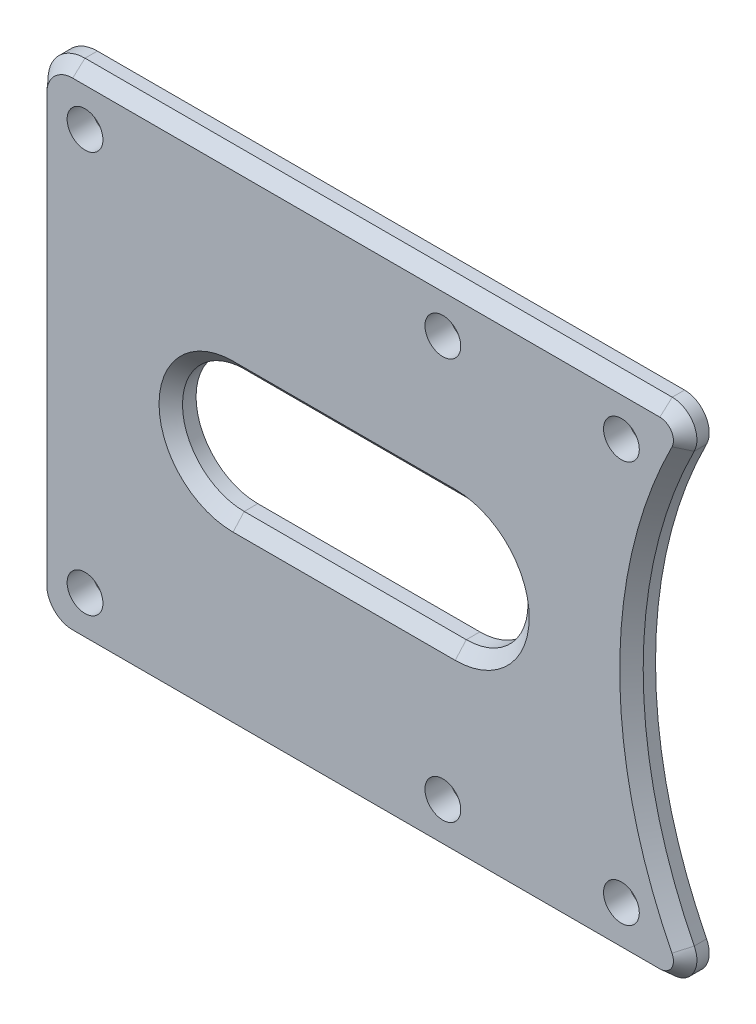
ISO-10303-21;
HEADER;
FILE_DESCRIPTION(('STEP AP214'),'2;1');
FILE_NAME('part.step','',(''),(''),'','','');
FILE_SCHEMA(('AUTOMOTIVE_DESIGN { 1 0 10303 214 1 1 1 1 }'));
ENDSEC;
DATA;
#1=APPLICATION_CONTEXT('core data for automotive mechanical design processes');
#2=APPLICATION_PROTOCOL_DEFINITION('international standard','automotive_design',2000,#1);
#3=PRODUCT_CONTEXT('',#1,'mechanical');
#4=PRODUCT('Part','Part','',(#3));
#5=PRODUCT_RELATED_PRODUCT_CATEGORY('part','',(#4));
#6=PRODUCT_DEFINITION_FORMATION('','',#4);
#7=PRODUCT_DEFINITION_CONTEXT('part definition',#1,'design');
#8=PRODUCT_DEFINITION('design','',#6,#7);
#9=PRODUCT_DEFINITION_SHAPE('','',#8);
#10=(LENGTH_UNIT() NAMED_UNIT(*) SI_UNIT(.MILLI.,.METRE.));
#11=(NAMED_UNIT(*) PLANE_ANGLE_UNIT() SI_UNIT($,.RADIAN.));
#12=(NAMED_UNIT(*) SI_UNIT($,.STERADIAN.) SOLID_ANGLE_UNIT());
#13=UNCERTAINTY_MEASURE_WITH_UNIT(LENGTH_MEASURE(1.E-05),#10,'distance_accuracy_value','');
#14=(GEOMETRIC_REPRESENTATION_CONTEXT(3) GLOBAL_UNCERTAINTY_ASSIGNED_CONTEXT((#13)) GLOBAL_UNIT_ASSIGNED_CONTEXT((#10,
#11,#12)) REPRESENTATION_CONTEXT('',''));
#15=CARTESIAN_POINT('',(0.,0.,0.));
#16=DIRECTION('',(0.,0.,1.));
#17=DIRECTION('',(1.,0.,0.));
#18=AXIS2_PLACEMENT_3D('',#15,#16,#17);
#19=CARTESIAN_POINT('',(151.26488013173,-17.2640458755177,2.));
#20=DIRECTION('',(0.,0.,-1.));
#21=DIRECTION('',(-1.,0.,0.));
#22=AXIS2_PLACEMENT_3D('',#19,#20,#21);
#23=PLANE('',#22);
#24=CARTESIAN_POINT('',(164.26488013173,0.,2.));
#25=DIRECTION('',(0.,0.,-1.));
#26=DIRECTION('',(-1.,0.,0.));
#27=AXIS2_PLACEMENT_3D('',#24,#25,#26);
#28=CIRCLE('',#27,6.00000000000001);
#29=CARTESIAN_POINT('',(164.26488013173,-6.00000000000001,2.));
#30=VERTEX_POINT('',#29);
#31=CARTESIAN_POINT('',(164.26488013173,6.00000000000001,2.));
#32=VERTEX_POINT('',#31);
#33=EDGE_CURVE('E328',#30,#32,#28,.T.);
#34=ORIENTED_EDGE('',*,*,#33,.T.);
#35=DIRECTION('',(1.,0.,0.));
#36=VECTOR('',#35,1.);
#37=CARTESIAN_POINT('',(182.26488013173,6.00000000000001,2.));
#38=LINE('',#37,#36);
#39=CARTESIAN_POINT('',(182.26488013173,6.00000000000001,2.));
#40=VERTEX_POINT('',#39);
#41=EDGE_CURVE('E330',#32,#40,#38,.T.);
#42=ORIENTED_EDGE('',*,*,#41,.T.);
#43=CARTESIAN_POINT('',(182.26488013173,0.,2.));
#44=DIRECTION('',(0.,0.,-1.));
#45=DIRECTION('',(-1.,0.,0.));
#46=AXIS2_PLACEMENT_3D('',#43,#44,#45);
#47=CIRCLE('',#46,6.00000000000001);
#48=CARTESIAN_POINT('',(182.26488013173,-6.00000000000001,2.));
#49=VERTEX_POINT('',#48);
#50=EDGE_CURVE('E326',#40,#49,#47,.T.);
#51=ORIENTED_EDGE('',*,*,#50,.T.);
#52=DIRECTION('',(-1.,0.,0.));
#53=VECTOR('',#52,1.);
#54=CARTESIAN_POINT('',(164.26488013173,-6.00000000000001,2.));
#55=LINE('',#54,#53);
#56=EDGE_CURVE('E324',#49,#30,#55,.T.);
#57=ORIENTED_EDGE('',*,*,#56,.T.);
#58=EDGE_LOOP('',(#34,#42,#51,#57));
#59=FACE_BOUND('',#58,.T.);
#60=CARTESIAN_POINT('',(198.852045310188,18.264045875515,2.));
#61=DIRECTION('',(0.,0.,-1.));
#62=DIRECTION('',(-1.,0.,0.));
#63=AXIS2_PLACEMENT_3D('',#60,#61,#62);
#64=CIRCLE('',#63,1.09959595570216);
#65=CARTESIAN_POINT('',(199.833480983863,17.7681675797256,2.));
#66=VERTEX_POINT('',#65);
#67=CARTESIAN_POINT('',(198.852045310188,19.3636418312171,2.));
#68=VERTEX_POINT('',#67);
#69=EDGE_CURVE('E279',#66,#68,#64,.F.);
#70=ORIENTED_EDGE('',*,*,#69,.T.);
#71=DIRECTION('',(-1.,0.,0.));
#72=VECTOR('',#71,1.);
#73=CARTESIAN_POINT('',(151.26488013173,19.3636418312172,2.));
#74=LINE('',#73,#72);
#75=CARTESIAN_POINT('',(151.26488013173,19.3636418312171,2.));
#76=VERTEX_POINT('',#75);
#77=EDGE_CURVE('E283',#68,#76,#74,.T.);
#78=ORIENTED_EDGE('',*,*,#77,.T.);
#79=CARTESIAN_POINT('',(151.26488013173,17.264045875515,2.));
#80=DIRECTION('',(0.,0.,-1.));
#81=DIRECTION('',(-1.,0.,0.));
#82=AXIS2_PLACEMENT_3D('',#79,#80,#81);
#83=CIRCLE('',#82,2.09959595570219);
#84=CARTESIAN_POINT('',(149.165284176028,17.264045875515,2.));
#85=VERTEX_POINT('',#84);
#86=EDGE_CURVE('E281',#76,#85,#83,.F.);
#87=ORIENTED_EDGE('',*,*,#86,.T.);
#88=DIRECTION('',(0.,-1.,0.));
#89=VECTOR('',#88,1.);
#90=CARTESIAN_POINT('',(149.165284176027,-17.2640458755177,2.));
#91=LINE('',#90,#89);
#92=CARTESIAN_POINT('',(149.165284176027,-17.2640458755177,2.));
#93=VERTEX_POINT('',#92);
#94=EDGE_CURVE('E277',#85,#93,#91,.T.);
#95=ORIENTED_EDGE('',*,*,#94,.T.);
#96=CARTESIAN_POINT('',(151.26488013173,-17.2640458755177,2.));
#97=DIRECTION('',(0.,0.,-1.));
#98=DIRECTION('',(-1.,0.,0.));
#99=AXIS2_PLACEMENT_3D('',#96,#97,#98);
#100=CIRCLE('',#99,2.09959595570214);
#101=CARTESIAN_POINT('',(151.26488013173,-19.3636418312199,2.));
#102=VERTEX_POINT('',#101);
#103=EDGE_CURVE('E273',#93,#102,#100,.F.);
#104=ORIENTED_EDGE('',*,*,#103,.T.);
#105=DIRECTION('',(1.,0.,0.));
#106=VECTOR('',#105,1.);
#107=CARTESIAN_POINT('',(151.26488013173,-19.3636418312199,2.));
#108=LINE('',#107,#106);
#109=CARTESIAN_POINT('',(198.852045310195,-19.3636418312199,2.));
#110=VERTEX_POINT('',#109);
#111=EDGE_CURVE('E269',#102,#110,#108,.T.);
#112=ORIENTED_EDGE('',*,*,#111,.T.);
#113=CARTESIAN_POINT('',(198.852045310195,-18.2640458755177,2.));
#114=DIRECTION('',(0.,0.,-1.));
#115=DIRECTION('',(-1.,0.,0.));
#116=AXIS2_PLACEMENT_3D('',#113,#114,#115);
#117=CIRCLE('',#116,1.09959595570218);
#118=CARTESIAN_POINT('',(199.83348098387,-17.768167579728,2.));
#119=VERTEX_POINT('',#118);
#120=EDGE_CURVE('E271',#110,#119,#117,.F.);
#121=ORIENTED_EDGE('',*,*,#120,.T.);
#122=CARTESIAN_POINT('',(235.000000000008,5.5795212200449E-12,2.));
#123=DIRECTION('',(0.,0.,-1.));
#124=DIRECTION('',(-1.,0.,0.));
#125=AXIS2_PLACEMENT_3D('',#122,#123,#124);
#126=CIRCLE('',#125,39.4004040442978);
#127=EDGE_CURVE('E275',#119,#66,#126,.T.);
#128=ORIENTED_EDGE('',*,*,#127,.T.);
#129=EDGE_LOOP('',(#70,#78,#87,#95,#104,#112,#121,#128));
#130=FACE_BOUND('',#129,.T.);
#131=CARTESIAN_POINT('',(195.735119868269,-16.2640458755166,2.));
#132=DIRECTION('',(0.,0.,1.));
#133=DIRECTION('',(1.,0.,0.));
#134=AXIS2_PLACEMENT_3D('',#131,#132,#133);
#135=CIRCLE('',#134,1.45);
#136=CARTESIAN_POINT('',(197.185119868269,-16.2640458755166,2.));
#137=VERTEX_POINT('',#136);
#138=EDGE_CURVE('E194',#137,#137,#135,.T.);
#139=ORIENTED_EDGE('',*,*,#138,.F.);
#140=EDGE_LOOP('',(#139));
#141=FACE_BOUND('',#140,.T.);
#142=CARTESIAN_POINT('',(181.26488013173,-16.264045875518,2.));
#143=DIRECTION('',(0.,0.,1.));
#144=DIRECTION('',(1.,0.,0.));
#145=AXIS2_PLACEMENT_3D('',#142,#143,#144);
#146=CIRCLE('',#145,1.45);
#147=CARTESIAN_POINT('',(182.71488013173,-16.264045875518,2.));
#148=VERTEX_POINT('',#147);
#149=EDGE_CURVE('E200',#148,#148,#146,.T.);
#150=ORIENTED_EDGE('',*,*,#149,.F.);
#151=EDGE_LOOP('',(#150));
#152=FACE_BOUND('',#151,.T.);
#153=CARTESIAN_POINT('',(152.26488013173,-16.2640458755177,2.));
#154=DIRECTION('',(0.,0.,1.));
#155=DIRECTION('',(1.,0.,0.));
#156=AXIS2_PLACEMENT_3D('',#153,#154,#155);
#157=CIRCLE('',#156,1.45);
#158=CARTESIAN_POINT('',(153.71488013173,-16.2640458755177,2.));
#159=VERTEX_POINT('',#158);
#160=EDGE_CURVE('E206',#159,#159,#157,.T.);
#161=ORIENTED_EDGE('',*,*,#160,.F.);
#162=EDGE_LOOP('',(#161));
#163=FACE_BOUND('',#162,.T.);
#164=CARTESIAN_POINT('',(195.73511986827,16.2640458755161,2.));
#165=DIRECTION('',(0.,0.,1.));
#166=DIRECTION('',(1.,0.,0.));
#167=AXIS2_PLACEMENT_3D('',#164,#165,#166);
#168=CIRCLE('',#167,1.45);
#169=CARTESIAN_POINT('',(197.18511986827,16.2640458755161,2.));
#170=VERTEX_POINT('',#169);
#171=EDGE_CURVE('E212',#170,#170,#168,.T.);
#172=ORIENTED_EDGE('',*,*,#171,.F.);
#173=EDGE_LOOP('',(#172));
#174=FACE_BOUND('',#173,.T.);
#175=CARTESIAN_POINT('',(181.26488013173,16.2640458755147,2.));
#176=DIRECTION('',(0.,0.,1.));
#177=DIRECTION('',(1.,0.,0.));
#178=AXIS2_PLACEMENT_3D('',#175,#176,#177);
#179=CIRCLE('',#178,1.45);
#180=CARTESIAN_POINT('',(182.71488013173,16.2640458755147,2.));
#181=VERTEX_POINT('',#180);
#182=EDGE_CURVE('E218',#181,#181,#179,.T.);
#183=ORIENTED_EDGE('',*,*,#182,.F.);
#184=EDGE_LOOP('',(#183));
#185=FACE_BOUND('',#184,.T.);
#186=CARTESIAN_POINT('',(152.26488013173,16.2640458755149,2.));
#187=DIRECTION('',(0.,0.,1.));
#188=DIRECTION('',(1.,0.,0.));
#189=AXIS2_PLACEMENT_3D('',#186,#187,#188);
#190=CIRCLE('',#189,1.45);
#191=CARTESIAN_POINT('',(153.71488013173,16.2640458755149,2.));
#192=VERTEX_POINT('',#191);
#193=EDGE_CURVE('E224',#192,#192,#190,.T.);
#194=ORIENTED_EDGE('',*,*,#193,.F.);
#195=EDGE_LOOP('',(#194));
#196=FACE_BOUND('',#195,.T.);
#197=ADVANCED_FACE('F36',(#59,#130,#141,#152,#163,#174,#185,#196),#23,.F.);
#198=CARTESIAN_POINT('',(151.26488013173,-17.2640458755177,0.));
#199=DIRECTION('',(0.,0.,-1.));
#200=DIRECTION('',(-1.,0.,0.));
#201=AXIS2_PLACEMENT_3D('',#198,#199,#200);
#202=PLANE('',#201);
#203=CARTESIAN_POINT('',(181.26488013173,-16.264045875518,0.));
#204=DIRECTION('',(0.,0.,1.));
#205=DIRECTION('',(1.,0.,0.));
#206=AXIS2_PLACEMENT_3D('',#203,#204,#205);
#207=CIRCLE('',#206,1.45);
#208=CARTESIAN_POINT('',(182.71488013173,-16.264045875518,0.));
#209=VERTEX_POINT('',#208);
#210=EDGE_CURVE('E197',#209,#209,#207,.T.);
#211=ORIENTED_EDGE('',*,*,#210,.T.);
#212=EDGE_LOOP('',(#211));
#213=FACE_BOUND('',#212,.T.);
#214=CARTESIAN_POINT('',(195.73511986827,16.2640458755161,0.));
#215=DIRECTION('',(0.,0.,1.));
#216=DIRECTION('',(1.,0.,0.));
#217=AXIS2_PLACEMENT_3D('',#214,#215,#216);
#218=CIRCLE('',#217,1.45);
#219=CARTESIAN_POINT('',(197.18511986827,16.2640458755161,0.));
#220=VERTEX_POINT('',#219);
#221=EDGE_CURVE('E209',#220,#220,#218,.T.);
#222=ORIENTED_EDGE('',*,*,#221,.T.);
#223=EDGE_LOOP('',(#222));
#224=FACE_BOUND('',#223,.T.);
#225=CARTESIAN_POINT('',(152.26488013173,16.2640458755149,0.));
#226=DIRECTION('',(0.,0.,1.));
#227=DIRECTION('',(1.,0.,0.));
#228=AXIS2_PLACEMENT_3D('',#225,#226,#227);
#229=CIRCLE('',#228,1.45);
#230=CARTESIAN_POINT('',(153.71488013173,16.2640458755149,0.));
#231=VERTEX_POINT('',#230);
#232=EDGE_CURVE('E221',#231,#231,#229,.T.);
#233=ORIENTED_EDGE('',*,*,#232,.T.);
#234=EDGE_LOOP('',(#233));
#235=FACE_BOUND('',#234,.T.);
#236=CARTESIAN_POINT('',(151.26488013173,-17.2640458755177,0.));
#237=DIRECTION('',(0.,0.,1.));
#238=DIRECTION('',(-1.,0.,0.));
#239=AXIS2_PLACEMENT_3D('',#236,#237,#238);
#240=CIRCLE('',#239,2.99999999999997);
#241=CARTESIAN_POINT('',(148.26488013173,-17.2640458755177,0.));
#242=VERTEX_POINT('',#241);
#243=CARTESIAN_POINT('',(151.26488013173,-20.2640458755177,0.));
#244=VERTEX_POINT('',#243);
#245=EDGE_CURVE('E227',#242,#244,#240,.T.);
#246=ORIENTED_EDGE('',*,*,#245,.F.);
#247=DIRECTION('',(0.,-1.,0.));
#248=VECTOR('',#247,1.);
#249=CARTESIAN_POINT('',(148.26488013173,-17.2640458755177,0.));
#250=LINE('',#249,#248);
#251=CARTESIAN_POINT('',(148.26488013173,17.264045875515,0.));
#252=VERTEX_POINT('',#251);
#253=EDGE_CURVE('E250',#252,#242,#250,.T.);
#254=ORIENTED_EDGE('',*,*,#253,.F.);
#255=CARTESIAN_POINT('',(151.26488013173,17.264045875515,0.));
#256=DIRECTION('',(0.,0.,1.));
#257=DIRECTION('',(-1.,0.,0.));
#258=AXIS2_PLACEMENT_3D('',#255,#256,#257);
#259=CIRCLE('',#258,3.00000000000003);
#260=CARTESIAN_POINT('',(151.26488013173,20.264045875515,0.));
#261=VERTEX_POINT('',#260);
#262=EDGE_CURVE('E247',#261,#252,#259,.T.);
#263=ORIENTED_EDGE('',*,*,#262,.F.);
#264=DIRECTION('',(-1.,0.,0.));
#265=VECTOR('',#264,1.);
#266=CARTESIAN_POINT('',(151.26488013173,20.264045875515,0.));
#267=LINE('',#266,#265);
#268=CARTESIAN_POINT('',(198.852045310188,20.264045875515,0.));
#269=VERTEX_POINT('',#268);
#270=EDGE_CURVE('E244',#269,#261,#267,.T.);
#271=ORIENTED_EDGE('',*,*,#270,.F.);
#272=CARTESIAN_POINT('',(198.852045310188,18.264045875515,0.));
#273=DIRECTION('',(0.,0.,1.));
#274=DIRECTION('',(1.,0.,0.));
#275=AXIS2_PLACEMENT_3D('',#272,#273,#274);
#276=CIRCLE('',#275,2.);
#277=CARTESIAN_POINT('',(200.637129492401,17.3621176841318,0.));
#278=VERTEX_POINT('',#277);
#279=EDGE_CURVE('E241',#278,#269,#276,.T.);
#280=ORIENTED_EDGE('',*,*,#279,.F.);
#281=CARTESIAN_POINT('',(235.000000000008,5.5795212200449E-12,0.));
#282=DIRECTION('',(0.,0.,-1.));
#283=DIRECTION('',(-1.,0.,0.));
#284=AXIS2_PLACEMENT_3D('',#281,#282,#283);
#285=CIRCLE('',#284,38.5);
#286=CARTESIAN_POINT('',(200.637129492408,-17.3621176841338,0.));
#287=VERTEX_POINT('',#286);
#288=EDGE_CURVE('E238',#287,#278,#285,.T.);
#289=ORIENTED_EDGE('',*,*,#288,.F.);
#290=CARTESIAN_POINT('',(198.852045310195,-18.2640458755177,0.));
#291=DIRECTION('',(0.,0.,1.));
#292=DIRECTION('',(1.,0.,0.));
#293=AXIS2_PLACEMENT_3D('',#290,#291,#292);
#294=CIRCLE('',#293,2.00000000000001);
#295=CARTESIAN_POINT('',(198.852045310195,-20.2640458755177,0.));
#296=VERTEX_POINT('',#295);
#297=EDGE_CURVE('E235',#296,#287,#294,.T.);
#298=ORIENTED_EDGE('',*,*,#297,.F.);
#299=DIRECTION('',(1.,0.,0.));
#300=VECTOR('',#299,1.);
#301=CARTESIAN_POINT('',(151.26488013173,-20.2640458755177,0.));
#302=LINE('',#301,#300);
#303=EDGE_CURVE('E232',#244,#296,#302,.T.);
#304=ORIENTED_EDGE('',*,*,#303,.F.);
#305=EDGE_LOOP('',(#246,#254,#263,#271,#280,#289,#298,#304));
#306=FACE_BOUND('',#305,.T.);
#307=CARTESIAN_POINT('',(181.26488013173,16.2640458755147,0.));
#308=DIRECTION('',(0.,0.,1.));
#309=DIRECTION('',(1.,0.,0.));
#310=AXIS2_PLACEMENT_3D('',#307,#308,#309);
#311=CIRCLE('',#310,1.45);
#312=CARTESIAN_POINT('',(182.71488013173,16.2640458755147,0.));
#313=VERTEX_POINT('',#312);
#314=EDGE_CURVE('E215',#313,#313,#311,.T.);
#315=ORIENTED_EDGE('',*,*,#314,.T.);
#316=EDGE_LOOP('',(#315));
#317=FACE_BOUND('',#316,.T.);
#318=CARTESIAN_POINT('',(152.26488013173,-16.2640458755177,0.));
#319=DIRECTION('',(0.,0.,1.));
#320=DIRECTION('',(1.,0.,0.));
#321=AXIS2_PLACEMENT_3D('',#318,#319,#320);
#322=CIRCLE('',#321,1.45);
#323=CARTESIAN_POINT('',(153.71488013173,-16.2640458755177,0.));
#324=VERTEX_POINT('',#323);
#325=EDGE_CURVE('E203',#324,#324,#322,.T.);
#326=ORIENTED_EDGE('',*,*,#325,.T.);
#327=EDGE_LOOP('',(#326));
#328=FACE_BOUND('',#327,.T.);
#329=CARTESIAN_POINT('',(195.735119868269,-16.2640458755166,0.));
#330=DIRECTION('',(0.,0.,1.));
#331=DIRECTION('',(1.,0.,0.));
#332=AXIS2_PLACEMENT_3D('',#329,#330,#331);
#333=CIRCLE('',#332,1.45);
#334=CARTESIAN_POINT('',(197.185119868269,-16.2640458755166,0.));
#335=VERTEX_POINT('',#334);
#336=EDGE_CURVE('E167',#335,#335,#333,.T.);
#337=ORIENTED_EDGE('',*,*,#336,.T.);
#338=EDGE_LOOP('',(#337));
#339=FACE_BOUND('',#338,.T.);
#340=DIRECTION('',(-1.,0.,0.));
#341=VECTOR('',#340,1.);
#342=CARTESIAN_POINT('',(164.26488013173,5.,0.));
#343=LINE('',#342,#341);
#344=CARTESIAN_POINT('',(182.26488013173,5.,0.));
#345=VERTEX_POINT('',#344);
#346=CARTESIAN_POINT('',(164.26488013173,5.,0.));
#347=VERTEX_POINT('',#346);
#348=EDGE_CURVE('E180',#345,#347,#343,.T.);
#349=ORIENTED_EDGE('',*,*,#348,.T.);
#350=CARTESIAN_POINT('',(164.26488013173,0.,0.));
#351=DIRECTION('',(0.,0.,1.));
#352=DIRECTION('',(1.,0.,0.));
#353=AXIS2_PLACEMENT_3D('',#350,#351,#352);
#354=CIRCLE('',#353,5.);
#355=CARTESIAN_POINT('',(164.26488013173,-5.,0.));
#356=VERTEX_POINT('',#355);
#357=EDGE_CURVE('E165',#347,#356,#354,.T.);
#358=ORIENTED_EDGE('',*,*,#357,.T.);
#359=DIRECTION('',(1.,0.,0.));
#360=VECTOR('',#359,1.);
#361=CARTESIAN_POINT('',(164.26488013173,-5.,0.));
#362=LINE('',#361,#360);
#363=CARTESIAN_POINT('',(182.26488013173,-5.,0.));
#364=VERTEX_POINT('',#363);
#365=EDGE_CURVE('E171',#356,#364,#362,.T.);
#366=ORIENTED_EDGE('',*,*,#365,.T.);
#367=CARTESIAN_POINT('',(182.26488013173,0.,0.));
#368=DIRECTION('',(0.,0.,1.));
#369=DIRECTION('',(1.,0.,0.));
#370=AXIS2_PLACEMENT_3D('',#367,#368,#369);
#371=CIRCLE('',#370,5.);
#372=EDGE_CURVE('E176',#364,#345,#371,.T.);
#373=ORIENTED_EDGE('',*,*,#372,.T.);
#374=EDGE_LOOP('',(#349,#358,#366,#373));
#375=FACE_BOUND('',#374,.T.);
#376=ADVANCED_FACE('F178',(#213,#224,#235,#306,#317,#328,#339,#375),#202,.T.);
#377=CARTESIAN_POINT('',(151.26488013173,-17.2640458755177,2.));
#378=DIRECTION('',(0.,0.,-1.));
#379=DIRECTION('',(-1.,0.,0.));
#380=AXIS2_PLACEMENT_3D('',#377,#378,#379);
#381=CYLINDRICAL_SURFACE('',#380,2.99999999999997);
#382=DIRECTION('',(0.,0.,-1.));
#383=VECTOR('',#382,1.);
#384=CARTESIAN_POINT('',(151.26488013173,-20.2640458755177,2.));
#385=LINE('',#384,#383);
#386=CARTESIAN_POINT('',(151.26488013173,-20.2640458755177,0.999999999999999));
#387=VERTEX_POINT('',#386);
#388=EDGE_CURVE('E267',#387,#244,#385,.T.);
#389=ORIENTED_EDGE('',*,*,#388,.F.);
#390=CARTESIAN_POINT('',(151.26488013173,-17.2640458755177,0.999999999999999));
#391=DIRECTION('',(0.,0.,-1.));
#392=DIRECTION('',(-1.,0.,0.));
#393=AXIS2_PLACEMENT_3D('',#390,#391,#392);
#394=CIRCLE('',#393,2.99999999999997);
#395=CARTESIAN_POINT('',(148.26488013173,-17.2640458755177,0.999999999999999));
#396=VERTEX_POINT('',#395);
#397=EDGE_CURVE('E297',#387,#396,#394,.T.);
#398=ORIENTED_EDGE('',*,*,#397,.T.);
#399=DIRECTION('',(0.,0.,-1.));
#400=VECTOR('',#399,1.);
#401=CARTESIAN_POINT('',(148.26488013173,-17.2640458755177,2.));
#402=LINE('',#401,#400);
#403=EDGE_CURVE('E253',#396,#242,#402,.T.);
#404=ORIENTED_EDGE('',*,*,#403,.T.);
#405=ORIENTED_EDGE('',*,*,#245,.T.);
#406=EDGE_LOOP('',(#389,#398,#404,#405));
#407=FACE_BOUND('',#406,.T.);
#408=ADVANCED_FACE('F379',(#407),#381,.T.);
#409=CARTESIAN_POINT('',(151.26488013173,-20.2640458755177,2.));
#410=DIRECTION('',(0.,1.,0.));
#411=DIRECTION('',(-1.,0.,0.));
#412=AXIS2_PLACEMENT_3D('',#409,#410,#411);
#413=PLANE('',#412);
#414=DIRECTION('',(0.,0.,-1.));
#415=VECTOR('',#414,1.);
#416=CARTESIAN_POINT('',(198.852045310195,-20.2640458755177,2.));
#417=LINE('',#416,#415);
#418=CARTESIAN_POINT('',(198.852045310195,-20.2640458755177,0.999999999999999));
#419=VERTEX_POINT('',#418);
#420=EDGE_CURVE('E265',#419,#296,#417,.T.);
#421=ORIENTED_EDGE('',*,*,#420,.F.);
#422=DIRECTION('',(-1.,0.,0.));
#423=VECTOR('',#422,1.);
#424=CARTESIAN_POINT('',(151.26488013173,-20.2640458755177,0.999999999999999));
#425=LINE('',#424,#423);
#426=EDGE_CURVE('E301',#419,#387,#425,.T.);
#427=ORIENTED_EDGE('',*,*,#426,.T.);
#428=ORIENTED_EDGE('',*,*,#388,.T.);
#429=ORIENTED_EDGE('',*,*,#303,.T.);
#430=EDGE_LOOP('',(#421,#427,#428,#429));
#431=FACE_BOUND('',#430,.T.);
#432=ADVANCED_FACE('F409',(#431),#413,.F.);
#433=CARTESIAN_POINT('',(198.852045310195,-18.2640458755177,2.));
#434=DIRECTION('',(0.,0.,-1.));
#435=DIRECTION('',(-1.,0.,0.));
#436=AXIS2_PLACEMENT_3D('',#433,#434,#435);
#437=CYLINDRICAL_SURFACE('',#436,2.00000000000001);
#438=DIRECTION('',(0.,0.,-1.));
#439=VECTOR('',#438,1.);
#440=CARTESIAN_POINT('',(200.637129492408,-17.3621176841338,2.));
#441=LINE('',#440,#439);
#442=CARTESIAN_POINT('',(200.637129492408,-17.3621176841338,0.999999999999999));
#443=VERTEX_POINT('',#442);
#444=EDGE_CURVE('E263',#443,#287,#441,.T.);
#445=ORIENTED_EDGE('',*,*,#444,.F.);
#446=CARTESIAN_POINT('',(198.852045310195,-18.2640458755177,0.999999999999999));
#447=DIRECTION('',(0.,0.,-1.));
#448=DIRECTION('',(-1.,0.,0.));
#449=AXIS2_PLACEMENT_3D('',#446,#447,#448);
#450=CIRCLE('',#449,2.00000000000001);
#451=EDGE_CURVE('E299',#443,#419,#450,.T.);
#452=ORIENTED_EDGE('',*,*,#451,.T.);
#453=ORIENTED_EDGE('',*,*,#420,.T.);
#454=ORIENTED_EDGE('',*,*,#297,.T.);
#455=EDGE_LOOP('',(#445,#452,#453,#454));
#456=FACE_BOUND('',#455,.T.);
#457=ADVANCED_FACE('F405',(#456),#437,.T.);
#458=CARTESIAN_POINT('',(235.000000000008,5.5795212200449E-12,2.));
#459=DIRECTION('',(0.,0.,-1.));
#460=DIRECTION('',(-1.,0.,0.));
#461=AXIS2_PLACEMENT_3D('',#458,#459,#460);
#462=CYLINDRICAL_SURFACE('',#461,38.5);
#463=DIRECTION('',(0.,0.,-1.));
#464=VECTOR('',#463,1.);
#465=CARTESIAN_POINT('',(200.637129492401,17.3621176841318,2.));
#466=LINE('',#465,#464);
#467=CARTESIAN_POINT('',(200.637129492401,17.3621176841318,0.999999999999999));
#468=VERTEX_POINT('',#467);
#469=EDGE_CURVE('E261',#468,#278,#466,.T.);
#470=ORIENTED_EDGE('',*,*,#469,.F.);
#471=CARTESIAN_POINT('',(235.000000000008,5.5795212200449E-12,0.999999999999999));
#472=DIRECTION('',(0.,0.,-1.));
#473=DIRECTION('',(-1.,0.,0.));
#474=AXIS2_PLACEMENT_3D('',#471,#472,#473);
#475=CIRCLE('',#474,38.5);
#476=EDGE_CURVE('E295',#468,#443,#475,.F.);
#477=ORIENTED_EDGE('',*,*,#476,.T.);
#478=ORIENTED_EDGE('',*,*,#444,.T.);
#479=ORIENTED_EDGE('',*,*,#288,.T.);
#480=EDGE_LOOP('',(#470,#477,#478,#479));
#481=FACE_BOUND('',#480,.T.);
#482=ADVANCED_FACE('F401',(#481),#462,.F.);
#483=CARTESIAN_POINT('',(198.852045310188,18.264045875515,2.));
#484=DIRECTION('',(0.,0.,-1.));
#485=DIRECTION('',(-1.,0.,0.));
#486=AXIS2_PLACEMENT_3D('',#483,#484,#485);
#487=CYLINDRICAL_SURFACE('',#486,2.);
#488=DIRECTION('',(0.,0.,-1.));
#489=VECTOR('',#488,1.);
#490=CARTESIAN_POINT('',(198.852045310188,20.264045875515,2.));
#491=LINE('',#490,#489);
#492=CARTESIAN_POINT('',(198.852045310188,20.264045875515,0.999999999999999));
#493=VERTEX_POINT('',#492);
#494=EDGE_CURVE('E259',#493,#269,#491,.T.);
#495=ORIENTED_EDGE('',*,*,#494,.F.);
#496=CARTESIAN_POINT('',(198.852045310188,18.264045875515,0.999999999999999));
#497=DIRECTION('',(0.,0.,-1.));
#498=DIRECTION('',(-1.,0.,0.));
#499=AXIS2_PLACEMENT_3D('',#496,#497,#498);
#500=CIRCLE('',#499,2.);
#501=EDGE_CURVE('E291',#493,#468,#500,.T.);
#502=ORIENTED_EDGE('',*,*,#501,.T.);
#503=ORIENTED_EDGE('',*,*,#469,.T.);
#504=ORIENTED_EDGE('',*,*,#279,.T.);
#505=EDGE_LOOP('',(#495,#502,#503,#504));
#506=FACE_BOUND('',#505,.T.);
#507=ADVANCED_FACE('F397',(#506),#487,.T.);
#508=CARTESIAN_POINT('',(151.26488013173,20.264045875515,2.));
#509=DIRECTION('',(0.,-1.,0.));
#510=DIRECTION('',(0.,0.,-1.));
#511=AXIS2_PLACEMENT_3D('',#508,#509,#510);
#512=PLANE('',#511);
#513=DIRECTION('',(0.,0.,-1.));
#514=VECTOR('',#513,1.);
#515=CARTESIAN_POINT('',(151.26488013173,20.264045875515,2.));
#516=LINE('',#515,#514);
#517=CARTESIAN_POINT('',(151.26488013173,20.264045875515,0.999999999999999));
#518=VERTEX_POINT('',#517);
#519=EDGE_CURVE('E257',#518,#261,#516,.T.);
#520=ORIENTED_EDGE('',*,*,#519,.F.);
#521=DIRECTION('',(1.,0.,0.));
#522=VECTOR('',#521,1.);
#523=CARTESIAN_POINT('',(151.26488013173,20.264045875515,0.999999999999999));
#524=LINE('',#523,#522);
#525=EDGE_CURVE('E286',#518,#493,#524,.T.);
#526=ORIENTED_EDGE('',*,*,#525,.T.);
#527=ORIENTED_EDGE('',*,*,#494,.T.);
#528=ORIENTED_EDGE('',*,*,#270,.T.);
#529=EDGE_LOOP('',(#520,#526,#527,#528));
#530=FACE_BOUND('',#529,.T.);
#531=ADVANCED_FACE('F393',(#530),#512,.F.);
#532=CARTESIAN_POINT('',(151.26488013173,17.264045875515,2.));
#533=DIRECTION('',(0.,0.,-1.));
#534=DIRECTION('',(-1.,0.,0.));
#535=AXIS2_PLACEMENT_3D('',#532,#533,#534);
#536=CYLINDRICAL_SURFACE('',#535,3.00000000000003);
#537=DIRECTION('',(0.,0.,-1.));
#538=VECTOR('',#537,1.);
#539=CARTESIAN_POINT('',(148.26488013173,17.264045875515,2.));
#540=LINE('',#539,#538);
#541=CARTESIAN_POINT('',(148.26488013173,17.264045875515,0.999999999999999));
#542=VERTEX_POINT('',#541);
#543=EDGE_CURVE('E255',#542,#252,#540,.T.);
#544=ORIENTED_EDGE('',*,*,#543,.F.);
#545=CARTESIAN_POINT('',(151.26488013173,17.264045875515,0.999999999999999));
#546=DIRECTION('',(0.,0.,-1.));
#547=DIRECTION('',(-1.,0.,0.));
#548=AXIS2_PLACEMENT_3D('',#545,#546,#547);
#549=CIRCLE('',#548,3.00000000000003);
#550=EDGE_CURVE('E289',#542,#518,#549,.T.);
#551=ORIENTED_EDGE('',*,*,#550,.T.);
#552=ORIENTED_EDGE('',*,*,#519,.T.);
#553=ORIENTED_EDGE('',*,*,#262,.T.);
#554=EDGE_LOOP('',(#544,#551,#552,#553));
#555=FACE_BOUND('',#554,.T.);
#556=ADVANCED_FACE('F389',(#555),#536,.T.);
#557=CARTESIAN_POINT('',(148.26488013173,-17.2640458755177,2.));
#558=DIRECTION('',(1.,0.,0.));
#559=DIRECTION('',(0.,1.,0.));
#560=AXIS2_PLACEMENT_3D('',#557,#558,#559);
#561=PLANE('',#560);
#562=ORIENTED_EDGE('',*,*,#403,.F.);
#563=DIRECTION('',(0.,1.,0.));
#564=VECTOR('',#563,1.);
#565=CARTESIAN_POINT('',(148.26488013173,-17.2640458755177,0.999999999999999));
#566=LINE('',#565,#564);
#567=EDGE_CURVE('E293',#396,#542,#566,.T.);
#568=ORIENTED_EDGE('',*,*,#567,.T.);
#569=ORIENTED_EDGE('',*,*,#543,.T.);
#570=ORIENTED_EDGE('',*,*,#253,.T.);
#571=EDGE_LOOP('',(#562,#568,#569,#570));
#572=FACE_BOUND('',#571,.T.);
#573=ADVANCED_FACE('F386',(#572),#561,.F.);
#574=CARTESIAN_POINT('',(152.26488013173,16.2640458755149,2.));
#575=DIRECTION('',(0.,0.,-1.));
#576=DIRECTION('',(-1.,0.,0.));
#577=AXIS2_PLACEMENT_3D('',#574,#575,#576);
#578=CYLINDRICAL_SURFACE('',#577,1.45);
#579=ORIENTED_EDGE('',*,*,#193,.T.);
#580=EDGE_LOOP('',(#579));
#581=FACE_BOUND('',#580,.T.);
#582=ORIENTED_EDGE('',*,*,#232,.F.);
#583=EDGE_LOOP('',(#582));
#584=FACE_BOUND('',#583,.T.);
#585=ADVANCED_FACE('F383',(#581,#584),#578,.F.);
#586=CARTESIAN_POINT('',(181.26488013173,16.2640458755147,2.));
#587=DIRECTION('',(0.,0.,-1.));
#588=DIRECTION('',(-1.,0.,0.));
#589=AXIS2_PLACEMENT_3D('',#586,#587,#588);
#590=CYLINDRICAL_SURFACE('',#589,1.45);
#591=ORIENTED_EDGE('',*,*,#182,.T.);
#592=EDGE_LOOP('',(#591));
#593=FACE_BOUND('',#592,.T.);
#594=ORIENTED_EDGE('',*,*,#314,.F.);
#595=EDGE_LOOP('',(#594));
#596=FACE_BOUND('',#595,.T.);
#597=ADVANCED_FACE('F607',(#593,#596),#590,.F.);
#598=CARTESIAN_POINT('',(195.73511986827,16.2640458755161,2.));
#599=DIRECTION('',(0.,0.,-1.));
#600=DIRECTION('',(-1.,0.,0.));
#601=AXIS2_PLACEMENT_3D('',#598,#599,#600);
#602=CYLINDRICAL_SURFACE('',#601,1.45);
#603=ORIENTED_EDGE('',*,*,#171,.T.);
#604=EDGE_LOOP('',(#603));
#605=FACE_BOUND('',#604,.T.);
#606=ORIENTED_EDGE('',*,*,#221,.F.);
#607=EDGE_LOOP('',(#606));
#608=FACE_BOUND('',#607,.T.);
#609=ADVANCED_FACE('F615',(#605,#608),#602,.F.);
#610=CARTESIAN_POINT('',(152.26488013173,-16.2640458755177,2.));
#611=DIRECTION('',(0.,0.,-1.));
#612=DIRECTION('',(-1.,0.,0.));
#613=AXIS2_PLACEMENT_3D('',#610,#611,#612);
#614=CYLINDRICAL_SURFACE('',#613,1.45);
#615=ORIENTED_EDGE('',*,*,#160,.T.);
#616=EDGE_LOOP('',(#615));
#617=FACE_BOUND('',#616,.T.);
#618=ORIENTED_EDGE('',*,*,#325,.F.);
#619=EDGE_LOOP('',(#618));
#620=FACE_BOUND('',#619,.T.);
#621=ADVANCED_FACE('F623',(#617,#620),#614,.F.);
#622=CARTESIAN_POINT('',(181.26488013173,-16.264045875518,2.));
#623=DIRECTION('',(0.,0.,-1.));
#624=DIRECTION('',(-1.,0.,0.));
#625=AXIS2_PLACEMENT_3D('',#622,#623,#624);
#626=CYLINDRICAL_SURFACE('',#625,1.45);
#627=ORIENTED_EDGE('',*,*,#149,.T.);
#628=EDGE_LOOP('',(#627));
#629=FACE_BOUND('',#628,.T.);
#630=ORIENTED_EDGE('',*,*,#210,.F.);
#631=EDGE_LOOP('',(#630));
#632=FACE_BOUND('',#631,.T.);
#633=ADVANCED_FACE('F632',(#629,#632),#626,.F.);
#634=CARTESIAN_POINT('',(195.735119868269,-16.2640458755166,2.));
#635=DIRECTION('',(0.,0.,-1.));
#636=DIRECTION('',(-1.,0.,0.));
#637=AXIS2_PLACEMENT_3D('',#634,#635,#636);
#638=CYLINDRICAL_SURFACE('',#637,1.45);
#639=ORIENTED_EDGE('',*,*,#138,.T.);
#640=EDGE_LOOP('',(#639));
#641=FACE_BOUND('',#640,.T.);
#642=ORIENTED_EDGE('',*,*,#336,.F.);
#643=EDGE_LOOP('',(#642));
#644=FACE_BOUND('',#643,.T.);
#645=ADVANCED_FACE('F545',(#641,#644),#638,.F.);
#646=CARTESIAN_POINT('',(164.26488013173,0.,2.));
#647=DIRECTION('',(0.,0.,-1.));
#648=DIRECTION('',(-1.,0.,0.));
#649=AXIS2_PLACEMENT_3D('',#646,#647,#648);
#650=CYLINDRICAL_SURFACE('',#649,5.);
#651=DIRECTION('',(0.,0.,-1.));
#652=VECTOR('',#651,1.);
#653=CARTESIAN_POINT('',(164.26488013173,5.,2.));
#654=LINE('',#653,#652);
#655=CARTESIAN_POINT('',(164.26488013173,5.,1.09959595570216));
#656=VERTEX_POINT('',#655);
#657=EDGE_CURVE('E189',#656,#347,#654,.T.);
#658=ORIENTED_EDGE('',*,*,#657,.F.);
#659=CARTESIAN_POINT('',(164.26488013173,0.,1.09959595570216));
#660=DIRECTION('',(0.,0.,-1.));
#661=DIRECTION('',(-1.,0.,0.));
#662=AXIS2_PLACEMENT_3D('',#659,#660,#661);
#663=CIRCLE('',#662,5.);
#664=CARTESIAN_POINT('',(164.26488013173,-5.,1.09959595570216));
#665=VERTEX_POINT('',#664);
#666=EDGE_CURVE('E60',#656,#665,#663,.F.);
#667=ORIENTED_EDGE('',*,*,#666,.T.);
#668=DIRECTION('',(0.,0.,-1.));
#669=VECTOR('',#668,1.);
#670=CARTESIAN_POINT('',(164.26488013173,-5.,2.));
#671=LINE('',#670,#669);
#672=EDGE_CURVE('E161',#665,#356,#671,.T.);
#673=ORIENTED_EDGE('',*,*,#672,.T.);
#674=ORIENTED_EDGE('',*,*,#357,.F.);
#675=EDGE_LOOP('',(#658,#667,#673,#674));
#676=FACE_BOUND('',#675,.T.);
#677=ADVANCED_FACE('F163',(#676),#650,.F.);
#678=CARTESIAN_POINT('',(164.26488013173,-5.,2.));
#679=DIRECTION('',(0.,1.,0.));
#680=DIRECTION('',(0.,0.,1.));
#681=AXIS2_PLACEMENT_3D('',#678,#679,#680);
#682=PLANE('',#681);
#683=ORIENTED_EDGE('',*,*,#672,.F.);
#684=DIRECTION('',(1.,0.,0.));
#685=VECTOR('',#684,1.);
#686=CARTESIAN_POINT('',(182.26488013173,-5.,1.09959595570216));
#687=LINE('',#686,#685);
#688=CARTESIAN_POINT('',(182.26488013173,-5.,1.09959595570216));
#689=VERTEX_POINT('',#688);
#690=EDGE_CURVE('E11',#665,#689,#687,.T.);
#691=ORIENTED_EDGE('',*,*,#690,.T.);
#692=DIRECTION('',(0.,0.,-1.));
#693=VECTOR('',#692,1.);
#694=CARTESIAN_POINT('',(182.26488013173,-5.,2.));
#695=LINE('',#694,#693);
#696=EDGE_CURVE('E168',#689,#364,#695,.T.);
#697=ORIENTED_EDGE('',*,*,#696,.T.);
#698=ORIENTED_EDGE('',*,*,#365,.F.);
#699=EDGE_LOOP('',(#683,#691,#697,#698));
#700=FACE_BOUND('',#699,.T.);
#701=ADVANCED_FACE('F172',(#700),#682,.T.);
#702=CARTESIAN_POINT('',(182.26488013173,0.,2.));
#703=DIRECTION('',(0.,0.,-1.));
#704=DIRECTION('',(-1.,0.,0.));
#705=AXIS2_PLACEMENT_3D('',#702,#703,#704);
#706=CYLINDRICAL_SURFACE('',#705,5.);
#707=ORIENTED_EDGE('',*,*,#696,.F.);
#708=CARTESIAN_POINT('',(182.26488013173,0.,1.09959595570216));
#709=DIRECTION('',(0.,0.,-1.));
#710=DIRECTION('',(-1.,0.,0.));
#711=AXIS2_PLACEMENT_3D('',#708,#709,#710);
#712=CIRCLE('',#711,5.);
#713=CARTESIAN_POINT('',(182.26488013173,5.,1.09959595570216));
#714=VERTEX_POINT('',#713);
#715=EDGE_CURVE('E46',#689,#714,#712,.F.);
#716=ORIENTED_EDGE('',*,*,#715,.T.);
#717=DIRECTION('',(0.,0.,-1.));
#718=VECTOR('',#717,1.);
#719=CARTESIAN_POINT('',(182.26488013173,5.,2.));
#720=LINE('',#719,#718);
#721=EDGE_CURVE('E191',#714,#345,#720,.T.);
#722=ORIENTED_EDGE('',*,*,#721,.T.);
#723=ORIENTED_EDGE('',*,*,#372,.F.);
#724=EDGE_LOOP('',(#707,#716,#722,#723));
#725=FACE_BOUND('',#724,.T.);
#726=ADVANCED_FACE('F364',(#725),#706,.F.);
#727=CARTESIAN_POINT('',(164.26488013173,5.,2.));
#728=DIRECTION('',(0.,-1.,0.));
#729=DIRECTION('',(0.,0.,-1.));
#730=AXIS2_PLACEMENT_3D('',#727,#728,#729);
#731=PLANE('',#730);
#732=ORIENTED_EDGE('',*,*,#721,.F.);
#733=DIRECTION('',(-1.,0.,0.));
#734=VECTOR('',#733,1.);
#735=CARTESIAN_POINT('',(164.26488013173,5.,1.09959595570216));
#736=LINE('',#735,#734);
#737=EDGE_CURVE('E303',#714,#656,#736,.T.);
#738=ORIENTED_EDGE('',*,*,#737,.T.);
#739=ORIENTED_EDGE('',*,*,#657,.T.);
#740=ORIENTED_EDGE('',*,*,#348,.F.);
#741=EDGE_LOOP('',(#732,#738,#739,#740));
#742=FACE_BOUND('',#741,.T.);
#743=ADVANCED_FACE('F362',(#742),#731,.T.);
#744=CARTESIAN_POINT('',(151.26488013173,-19.3636418312199,2.));
#745=DIRECTION('',(0.,0.743144825477396,-0.669130606358856));
#746=DIRECTION('',(1.,0.,0.));
#747=AXIS2_PLACEMENT_3D('',#744,#745,#746);
#748=PLANE('',#747);
#749=DIRECTION('',(0.,0.669130606358856,0.743144825477396));
#750=VECTOR('',#749,1.);
#751=CARTESIAN_POINT('',(151.26488013173,-20.2640458755177,0.999999999999999));
#752=LINE('',#751,#750);
#753=EDGE_CURVE('E184',#387,#102,#752,.T.);
#754=ORIENTED_EDGE('',*,*,#753,.F.);
#755=ORIENTED_EDGE('',*,*,#426,.F.);
#756=DIRECTION('',(0.,-0.669130606358856,-0.743144825477396));
#757=VECTOR('',#756,1.);
#758=CARTESIAN_POINT('',(198.852045310195,-19.3636418312199,2.));
#759=LINE('',#758,#757);
#760=EDGE_CURVE('E181',#110,#419,#759,.T.);
#761=ORIENTED_EDGE('',*,*,#760,.F.);
#762=ORIENTED_EDGE('',*,*,#111,.F.);
#763=EDGE_LOOP('',(#754,#755,#761,#762));
#764=FACE_BOUND('',#763,.T.);
#765=ADVANCED_FACE('F371',(#764),#748,.F.);
#766=CARTESIAN_POINT('',(198.852045310195,-18.2640458755177,2.));
#767=DIRECTION('',(0.,0.,-1.));
#768=DIRECTION('',(-1.,0.,0.));
#769=AXIS2_PLACEMENT_3D('',#766,#767,#768);
#770=CONICAL_SURFACE('',#769,1.09959595570217,0.733038285837617);
#771=ORIENTED_EDGE('',*,*,#760,.T.);
#772=ORIENTED_EDGE('',*,*,#451,.F.);
#773=DIRECTION('',(0.597227230622894,0.301753878796411,-0.743144825477396));
#774=VECTOR('',#773,1.);
#775=CARTESIAN_POINT('',(199.83348098387,-17.768167579728,2.));
#776=LINE('',#775,#774);
#777=EDGE_CURVE('E317',#119,#443,#776,.T.);
#778=ORIENTED_EDGE('',*,*,#777,.F.);
#779=ORIENTED_EDGE('',*,*,#120,.F.);
#780=EDGE_LOOP('',(#771,#772,#778,#779));
#781=FACE_BOUND('',#780,.T.);
#782=ADVANCED_FACE('F459',(#781),#770,.T.);
#783=CARTESIAN_POINT('',(151.26488013173,-17.2640458755177,2.));
#784=DIRECTION('',(0.,0.,-1.));
#785=DIRECTION('',(-1.,0.,0.));
#786=AXIS2_PLACEMENT_3D('',#783,#784,#785);
#787=CONICAL_SURFACE('',#786,2.09959595570214,0.733038285837612);
#788=ORIENTED_EDGE('',*,*,#753,.T.);
#789=ORIENTED_EDGE('',*,*,#103,.F.);
#790=DIRECTION('',(0.669130606358856,0.,0.743144825477396));
#791=VECTOR('',#790,1.);
#792=CARTESIAN_POINT('',(148.26488013173,-17.2640458755177,0.999999999999999));
#793=LINE('',#792,#791);
#794=EDGE_CURVE('E314',#396,#93,#793,.T.);
#795=ORIENTED_EDGE('',*,*,#794,.F.);
#796=ORIENTED_EDGE('',*,*,#397,.F.);
#797=EDGE_LOOP('',(#788,#789,#795,#796));
#798=FACE_BOUND('',#797,.T.);
#799=ADVANCED_FACE('F452',(#798),#787,.T.);
#800=CARTESIAN_POINT('',(235.000000000008,5.5795212200449E-12,2.));
#801=DIRECTION('',(0.,0.,1.));
#802=DIRECTION('',(1.,0.,0.));
#803=AXIS2_PLACEMENT_3D('',#800,#801,#802);
#804=CONICAL_SURFACE('',#803,39.4004040442978,0.733038285837616);
#805=ORIENTED_EDGE('',*,*,#777,.T.);
#806=ORIENTED_EDGE('',*,*,#476,.F.);
#807=DIRECTION('',(0.597227230623003,-0.301753878796177,-0.743144825477404));
#808=VECTOR('',#807,1.);
#809=CARTESIAN_POINT('',(199.833480983863,17.7681675797256,2.));
#810=LINE('',#809,#808);
#811=EDGE_CURVE('E311',#66,#468,#810,.T.);
#812=ORIENTED_EDGE('',*,*,#811,.F.);
#813=ORIENTED_EDGE('',*,*,#127,.F.);
#814=EDGE_LOOP('',(#805,#806,#812,#813));
#815=FACE_BOUND('',#814,.T.);
#816=ADVANCED_FACE('F445',(#815),#804,.F.);
#817=CARTESIAN_POINT('',(149.165284176027,-17.2640458755177,2.));
#818=DIRECTION('',(0.743144825477396,0.,-0.669130606358856));
#819=DIRECTION('',(0.,-1.,0.));
#820=AXIS2_PLACEMENT_3D('',#817,#818,#819);
#821=PLANE('',#820);
#822=ORIENTED_EDGE('',*,*,#794,.T.);
#823=ORIENTED_EDGE('',*,*,#94,.F.);
#824=DIRECTION('',(0.669130606358856,0.,0.743144825477396));
#825=VECTOR('',#824,1.);
#826=CARTESIAN_POINT('',(148.26488013173,17.264045875515,0.999999999999999));
#827=LINE('',#826,#825);
#828=EDGE_CURVE('E308',#542,#85,#827,.T.);
#829=ORIENTED_EDGE('',*,*,#828,.F.);
#830=ORIENTED_EDGE('',*,*,#567,.F.);
#831=EDGE_LOOP('',(#822,#823,#829,#830));
#832=FACE_BOUND('',#831,.T.);
#833=ADVANCED_FACE('F438',(#832),#821,.F.);
#834=CARTESIAN_POINT('',(198.852045310188,18.264045875515,2.));
#835=DIRECTION('',(0.,0.,-1.));
#836=DIRECTION('',(-1.,0.,0.));
#837=AXIS2_PLACEMENT_3D('',#834,#835,#836);
#838=CONICAL_SURFACE('',#837,1.09959595570216,0.733038285837619);
#839=ORIENTED_EDGE('',*,*,#811,.T.);
#840=ORIENTED_EDGE('',*,*,#501,.F.);
#841=DIRECTION('',(0.,0.669130606358858,-0.743144825477395));
#842=VECTOR('',#841,1.);
#843=CARTESIAN_POINT('',(198.852045310188,19.3636418312171,2.));
#844=LINE('',#843,#842);
#845=EDGE_CURVE('E306',#68,#493,#844,.T.);
#846=ORIENTED_EDGE('',*,*,#845,.F.);
#847=ORIENTED_EDGE('',*,*,#69,.F.);
#848=EDGE_LOOP('',(#839,#840,#846,#847));
#849=FACE_BOUND('',#848,.T.);
#850=ADVANCED_FACE('F431',(#849),#838,.T.);
#851=CARTESIAN_POINT('',(151.26488013173,17.264045875515,2.));
#852=DIRECTION('',(0.,0.,-1.));
#853=DIRECTION('',(-1.,0.,0.));
#854=AXIS2_PLACEMENT_3D('',#851,#852,#853);
#855=CONICAL_SURFACE('',#854,2.09959595570219,0.733038285837617);
#856=ORIENTED_EDGE('',*,*,#828,.T.);
#857=ORIENTED_EDGE('',*,*,#86,.F.);
#858=DIRECTION('',(0.,-0.669130606358857,0.743144825477396));
#859=VECTOR('',#858,1.);
#860=CARTESIAN_POINT('',(151.26488013173,20.264045875515,0.999999999999999));
#861=LINE('',#860,#859);
#862=EDGE_CURVE('E304',#518,#76,#861,.T.);
#863=ORIENTED_EDGE('',*,*,#862,.F.);
#864=ORIENTED_EDGE('',*,*,#550,.F.);
#865=EDGE_LOOP('',(#856,#857,#863,#864));
#866=FACE_BOUND('',#865,.T.);
#867=ADVANCED_FACE('F424',(#866),#855,.T.);
#868=CARTESIAN_POINT('',(151.26488013173,19.3636418312172,2.));
#869=DIRECTION('',(0.,-0.743144825477397,-0.669130606358855));
#870=DIRECTION('',(-1.,0.,0.));
#871=AXIS2_PLACEMENT_3D('',#868,#869,#870);
#872=PLANE('',#871);
#873=ORIENTED_EDGE('',*,*,#845,.T.);
#874=ORIENTED_EDGE('',*,*,#525,.F.);
#875=ORIENTED_EDGE('',*,*,#862,.T.);
#876=ORIENTED_EDGE('',*,*,#77,.F.);
#877=EDGE_LOOP('',(#873,#874,#875,#876));
#878=FACE_BOUND('',#877,.T.);
#879=ADVANCED_FACE('F418',(#878),#872,.F.);
#880=CARTESIAN_POINT('',(164.26488013173,-5.,1.09959595570216));
#881=DIRECTION('',(0.,0.669130606358857,0.743144825477396));
#882=DIRECTION('',(-1.,0.,0.));
#883=AXIS2_PLACEMENT_3D('',#880,#881,#882);
#884=PLANE('',#883);
#885=DIRECTION('',(0.,0.743144825477396,-0.669130606358857));
#886=VECTOR('',#885,1.);
#887=CARTESIAN_POINT('',(164.26488013173,-6.00000000000001,2.));
#888=LINE('',#887,#886);
#889=EDGE_CURVE('E338',#30,#665,#888,.T.);
#890=ORIENTED_EDGE('',*,*,#889,.F.);
#891=ORIENTED_EDGE('',*,*,#56,.F.);
#892=DIRECTION('',(0.,-0.743144825477396,0.669130606358857));
#893=VECTOR('',#892,1.);
#894=CARTESIAN_POINT('',(182.26488013173,-5.,1.09959595570216));
#895=LINE('',#894,#893);
#896=EDGE_CURVE('E41',#689,#49,#895,.T.);
#897=ORIENTED_EDGE('',*,*,#896,.F.);
#898=ORIENTED_EDGE('',*,*,#690,.F.);
#899=EDGE_LOOP('',(#890,#891,#897,#898));
#900=FACE_BOUND('',#899,.T.);
#901=ADVANCED_FACE('F39',(#900),#884,.T.);
#902=CARTESIAN_POINT('',(182.26488013173,0.,1.09959595570216));
#903=DIRECTION('',(0.,0.,1.));
#904=DIRECTION('',(1.,0.,0.));
#905=AXIS2_PLACEMENT_3D('',#902,#903,#904);
#906=CONICAL_SURFACE('',#905,5.,0.83775804095728);
#907=ORIENTED_EDGE('',*,*,#896,.T.);
#908=ORIENTED_EDGE('',*,*,#50,.F.);
#909=DIRECTION('',(0.,0.743144825477395,0.669130606358857));
#910=VECTOR('',#909,1.);
#911=CARTESIAN_POINT('',(182.26488013173,5.,1.09959595570216));
#912=LINE('',#911,#910);
#913=EDGE_CURVE('E337',#714,#40,#912,.T.);
#914=ORIENTED_EDGE('',*,*,#913,.F.);
#915=ORIENTED_EDGE('',*,*,#715,.F.);
#916=EDGE_LOOP('',(#907,#908,#914,#915));
#917=FACE_BOUND('',#916,.T.);
#918=ADVANCED_FACE('F348',(#917),#906,.F.);
#919=CARTESIAN_POINT('',(164.26488013173,0.,1.09959595570216));
#920=DIRECTION('',(0.,0.,1.));
#921=DIRECTION('',(1.,0.,0.));
#922=AXIS2_PLACEMENT_3D('',#919,#920,#921);
#923=CONICAL_SURFACE('',#922,5.,0.83775804095728);
#924=ORIENTED_EDGE('',*,*,#889,.T.);
#925=ORIENTED_EDGE('',*,*,#666,.F.);
#926=DIRECTION('',(0.,-0.743144825477395,-0.669130606358857));
#927=VECTOR('',#926,1.);
#928=CARTESIAN_POINT('',(164.26488013173,6.00000000000001,2.));
#929=LINE('',#928,#927);
#930=EDGE_CURVE('E335',#32,#656,#929,.T.);
#931=ORIENTED_EDGE('',*,*,#930,.F.);
#932=ORIENTED_EDGE('',*,*,#33,.F.);
#933=EDGE_LOOP('',(#924,#925,#931,#932));
#934=FACE_BOUND('',#933,.T.);
#935=ADVANCED_FACE('F359',(#934),#923,.F.);
#936=CARTESIAN_POINT('',(164.26488013173,5.,1.09959595570216));
#937=DIRECTION('',(0.,-0.669130606358857,0.743144825477396));
#938=DIRECTION('',(1.,0.,0.));
#939=AXIS2_PLACEMENT_3D('',#936,#937,#938);
#940=PLANE('',#939);
#941=ORIENTED_EDGE('',*,*,#913,.T.);
#942=ORIENTED_EDGE('',*,*,#41,.F.);
#943=ORIENTED_EDGE('',*,*,#930,.T.);
#944=ORIENTED_EDGE('',*,*,#737,.F.);
#945=EDGE_LOOP('',(#941,#942,#943,#944));
#946=FACE_BOUND('',#945,.T.);
#947=ADVANCED_FACE('F357',(#946),#940,.T.);
#948=CLOSED_SHELL('',(#197,#376,#408,#432,#457,#482,#507,#531,#556,#573,#585,#597,#609,#621,
#633,#645,#677,#701,#726,#743,#765,#782,#799,#816,#833,#850,#867,#879,#901,#918,#935,#947));
#949=MANIFOLD_SOLID_BREP('B2',#948);
#950=ADVANCED_BREP_SHAPE_REPRESENTATION('',(#18,#949),#14);
#951=SHAPE_DEFINITION_REPRESENTATION(#9,#950);
ENDSEC;
END-ISO-10303-21;
